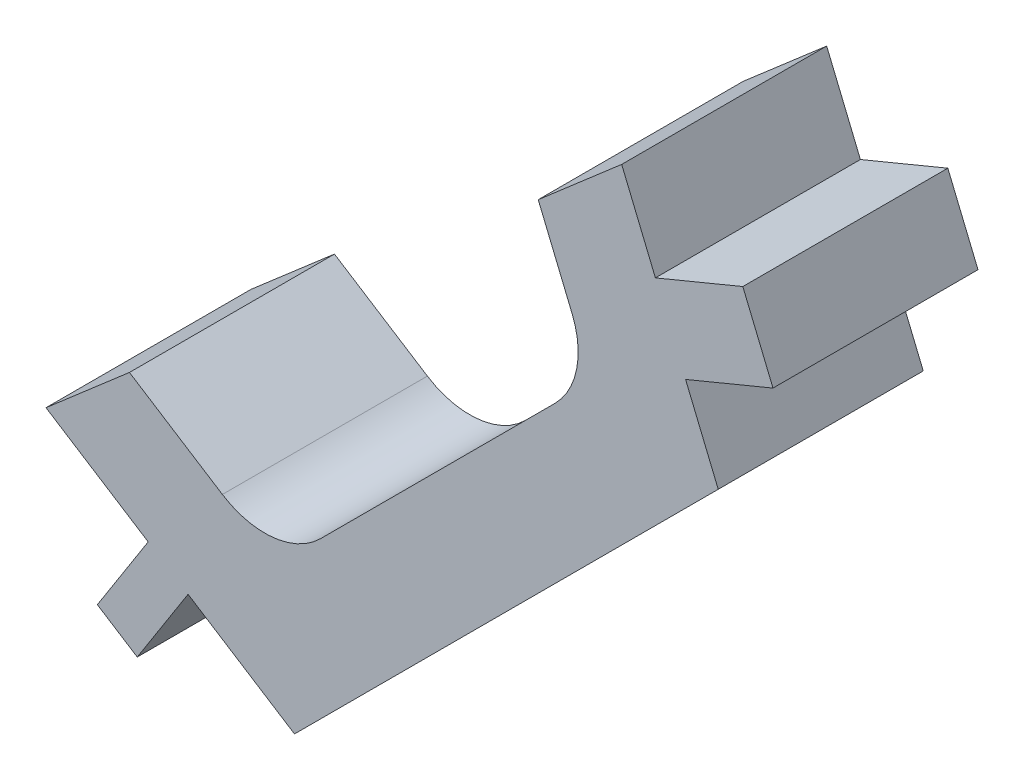
ISO-10303-21;
HEADER;
FILE_DESCRIPTION(('STEP AP214'),'2;1');
FILE_NAME('part.step','',(''),(''),'','','');
FILE_SCHEMA(('AUTOMOTIVE_DESIGN { 1 0 10303 214 1 1 1 1 }'));
ENDSEC;
DATA;
#1=APPLICATION_CONTEXT('core data for automotive mechanical design processes');
#2=APPLICATION_PROTOCOL_DEFINITION('international standard','automotive_design',2000,#1);
#3=PRODUCT_CONTEXT('',#1,'mechanical');
#4=PRODUCT('Part','Part','',(#3));
#5=PRODUCT_RELATED_PRODUCT_CATEGORY('part','',(#4));
#6=PRODUCT_DEFINITION_FORMATION('','',#4);
#7=PRODUCT_DEFINITION_CONTEXT('part definition',#1,'design');
#8=PRODUCT_DEFINITION('design','',#6,#7);
#9=PRODUCT_DEFINITION_SHAPE('','',#8);
#10=(LENGTH_UNIT() NAMED_UNIT(*) SI_UNIT(.MILLI.,.METRE.));
#11=(NAMED_UNIT(*) PLANE_ANGLE_UNIT() SI_UNIT($,.RADIAN.));
#12=(NAMED_UNIT(*) SI_UNIT($,.STERADIAN.) SOLID_ANGLE_UNIT());
#13=UNCERTAINTY_MEASURE_WITH_UNIT(LENGTH_MEASURE(1.E-05),#10,'distance_accuracy_value','');
#14=(GEOMETRIC_REPRESENTATION_CONTEXT(3) GLOBAL_UNCERTAINTY_ASSIGNED_CONTEXT((#13)) GLOBAL_UNIT_ASSIGNED_CONTEXT((#10,
#11,#12)) REPRESENTATION_CONTEXT('',''));
#15=CARTESIAN_POINT('',(0.,0.,0.));
#16=DIRECTION('',(0.,0.,1.));
#17=DIRECTION('',(1.,0.,0.));
#18=AXIS2_PLACEMENT_3D('',#15,#16,#17);
#19=CARTESIAN_POINT('',(159.283805602828,-35.5040593184353,67.31));
#20=DIRECTION('',(0.537299608346812,0.843391445812893,0.));
#21=DIRECTION('',(-0.843391445812893,0.537299608346812,0.));
#22=AXIS2_PLACEMENT_3D('',#19,#20,#21);
#23=PLANE('',#22);
#24=DIRECTION('',(0.843391445812893,-0.537299608346812,0.));
#25=VECTOR('',#24,1.);
#26=CARTESIAN_POINT('',(159.283805602828,-35.5040593184353,50.8));
#27=LINE('',#26,#25);
#28=CARTESIAN_POINT('',(23.4233337002451,51.0486069499697,50.8));
#29=VERTEX_POINT('',#28);
#30=CARTESIAN_POINT('',(31.6531404920107,45.8056417907444,50.8));
#31=VERTEX_POINT('',#30);
#32=EDGE_CURVE('E163',#29,#31,#27,.T.);
#33=ORIENTED_EDGE('',*,*,#32,.T.);
#34=DIRECTION('',(0.,0.,-1.));
#35=VECTOR('',#34,1.);
#36=CARTESIAN_POINT('',(31.6531404920107,45.8056417907444,67.31));
#37=LINE('',#36,#35);
#38=CARTESIAN_POINT('',(31.6531404920107,45.8056417907444,67.31));
#39=VERTEX_POINT('',#38);
#40=EDGE_CURVE('E11',#39,#31,#37,.T.);
#41=ORIENTED_EDGE('',*,*,#40,.F.);
#42=DIRECTION('',(0.843391445812893,-0.537299608346812,0.));
#43=VECTOR('',#42,1.);
#44=CARTESIAN_POINT('',(159.283805602828,-35.5040593184353,67.31));
#45=LINE('',#44,#43);
#46=CARTESIAN_POINT('',(23.4233337002451,51.0486069499697,67.31));
#47=VERTEX_POINT('',#46);
#48=EDGE_CURVE('E167',#47,#39,#45,.T.);
#49=ORIENTED_EDGE('',*,*,#48,.F.);
#50=DIRECTION('',(0.,0.,-1.));
#51=VECTOR('',#50,1.);
#52=CARTESIAN_POINT('',(23.4233337002451,51.0486069499697,67.31));
#53=LINE('',#52,#51);
#54=EDGE_CURVE('E179',#47,#29,#53,.T.);
#55=ORIENTED_EDGE('',*,*,#54,.T.);
#56=EDGE_LOOP('',(#33,#41,#49,#55));
#57=FACE_BOUND('',#56,.T.);
#58=ADVANCED_FACE('F37',(#57),#23,.F.);
#59=CARTESIAN_POINT('',(-26.0306651108173,-44.7397958972667,67.31));
#60=DIRECTION('',(0.843391445812893,-0.537299608346812,0.));
#61=DIRECTION('',(0.537299608346812,0.843391445812893,0.));
#62=AXIS2_PLACEMENT_3D('',#59,#60,#61);
#63=PLANE('',#62);
#64=DIRECTION('',(-0.537299608346812,-0.843391445812893,0.));
#65=VECTOR('',#64,1.);
#66=CARTESIAN_POINT('',(-26.0306651108173,-44.7397958972667,50.8));
#67=LINE('',#66,#65);
#68=CARTESIAN_POINT('',(27.558917476408,39.3789989736501,50.8));
#69=VERTEX_POINT('',#68);
#70=EDGE_CURVE('E233',#31,#69,#67,.T.);
#71=ORIENTED_EDGE('',*,*,#70,.T.);
#72=DIRECTION('',(0.,0.,-1.));
#73=VECTOR('',#72,1.);
#74=CARTESIAN_POINT('',(27.5589174764079,39.3789989736501,67.31));
#75=LINE('',#74,#73);
#76=CARTESIAN_POINT('',(27.5589174764079,39.3789989736501,67.31));
#77=VERTEX_POINT('',#76);
#78=EDGE_CURVE('E45',#77,#69,#75,.T.);
#79=ORIENTED_EDGE('',*,*,#78,.F.);
#80=DIRECTION('',(-0.537299608346812,-0.843391445812893,0.));
#81=VECTOR('',#80,1.);
#82=CARTESIAN_POINT('',(-26.0306651108173,-44.7397958972667,67.31));
#83=LINE('',#82,#81);
#84=EDGE_CURVE('E344',#39,#77,#83,.T.);
#85=ORIENTED_EDGE('',*,*,#84,.F.);
#86=ORIENTED_EDGE('',*,*,#40,.T.);
#87=EDGE_LOOP('',(#71,#79,#85,#86));
#88=FACE_BOUND('',#87,.T.);
#89=ADVANCED_FACE('F234',(#88),#63,.F.);
#90=CARTESIAN_POINT('',(155.189582587225,-41.9307021355267,67.31));
#91=DIRECTION('',(-0.537299608346799,-0.843391445812902,0.));
#92=DIRECTION('',(0.843391445812902,-0.537299608346799,0.));
#93=AXIS2_PLACEMENT_3D('',#90,#91,#92);
#94=PLANE('',#93);
#95=DIRECTION('',(-0.843391445812902,0.537299608346799,0.));
#96=VECTOR('',#95,1.);
#97=CARTESIAN_POINT('',(155.189582587225,-41.9307021355267,50.8));
#98=LINE('',#97,#96);
#99=CARTESIAN_POINT('',(30.7722388849552,37.3318874658488,50.8));
#100=VERTEX_POINT('',#99);
#101=EDGE_CURVE('E229',#100,#69,#98,.T.);
#102=ORIENTED_EDGE('',*,*,#101,.F.);
#103=DIRECTION('',(0.,0.,-1.));
#104=VECTOR('',#103,1.);
#105=CARTESIAN_POINT('',(30.7722388849551,37.3318874658488,67.31));
#106=LINE('',#105,#104);
#107=CARTESIAN_POINT('',(30.7722388849551,37.3318874658488,67.31));
#108=VERTEX_POINT('',#107);
#109=EDGE_CURVE('E220',#108,#100,#106,.T.);
#110=ORIENTED_EDGE('',*,*,#109,.F.);
#111=DIRECTION('',(-0.843391445812902,0.537299608346799,0.));
#112=VECTOR('',#111,1.);
#113=CARTESIAN_POINT('',(155.189582587225,-41.9307021355267,67.31));
#114=LINE('',#113,#112);
#115=EDGE_CURVE('E231',#108,#77,#114,.T.);
#116=ORIENTED_EDGE('',*,*,#115,.T.);
#117=ORIENTED_EDGE('',*,*,#78,.T.);
#118=EDGE_LOOP('',(#102,#110,#116,#117));
#119=FACE_BOUND('',#118,.T.);
#120=ADVANCED_FACE('F228',(#119),#94,.T.);
#121=CARTESIAN_POINT('',(-22.8173437022702,-46.786907405067,67.31));
#122=DIRECTION('',(-0.84339144581289,0.537299608346817,0.));
#123=DIRECTION('',(-0.537299608346817,-0.84339144581289,0.));
#124=AXIS2_PLACEMENT_3D('',#121,#122,#123);
#125=PLANE('',#124);
#126=DIRECTION('',(0.537299608346817,0.84339144581289,0.));
#127=VECTOR('',#126,1.);
#128=CARTESIAN_POINT('',(-22.8173437022702,-46.786907405067,50.8));
#129=LINE('',#128,#127);
#130=CARTESIAN_POINT('',(34.8664619005579,43.7585302829429,50.8));
#131=VERTEX_POINT('',#130);
#132=EDGE_CURVE('E237',#100,#131,#129,.T.);
#133=ORIENTED_EDGE('',*,*,#132,.T.);
#134=DIRECTION('',(0.,0.,-1.));
#135=VECTOR('',#134,1.);
#136=CARTESIAN_POINT('',(34.8664619005579,43.758530282943,67.31));
#137=LINE('',#136,#135);
#138=CARTESIAN_POINT('',(34.8664619005579,43.758530282943,67.31));
#139=VERTEX_POINT('',#138);
#140=EDGE_CURVE('E217',#139,#131,#137,.T.);
#141=ORIENTED_EDGE('',*,*,#140,.F.);
#142=DIRECTION('',(0.537299608346817,0.84339144581289,0.));
#143=VECTOR('',#142,1.);
#144=CARTESIAN_POINT('',(-22.8173437022702,-46.786907405067,67.31));
#145=LINE('',#144,#143);
#146=EDGE_CURVE('E341',#108,#139,#145,.T.);
#147=ORIENTED_EDGE('',*,*,#146,.F.);
#148=ORIENTED_EDGE('',*,*,#109,.T.);
#149=EDGE_LOOP('',(#133,#141,#147,#148));
#150=FACE_BOUND('',#149,.T.);
#151=ADVANCED_FACE('F340',(#150),#125,.F.);
#152=CARTESIAN_POINT('',(159.283805602828,-35.504059318435,67.31));
#153=DIRECTION('',(0.537299608346811,0.843391445812894,0.));
#154=DIRECTION('',(-0.843391445812894,0.537299608346811,0.));
#155=AXIS2_PLACEMENT_3D('',#152,#153,#154);
#156=PLANE('',#155);
#157=DIRECTION('',(0.843391445812894,-0.537299608346811,0.));
#158=VECTOR('',#157,1.);
#159=CARTESIAN_POINT('',(159.283805602828,-35.504059318435,50.8));
#160=LINE('',#159,#158);
#161=CARTESIAN_POINT('',(43.4353189900168,38.2995662621395,50.8));
#162=VERTEX_POINT('',#161);
#163=EDGE_CURVE('E244',#131,#162,#160,.T.);
#164=ORIENTED_EDGE('',*,*,#163,.T.);
#165=DIRECTION('',(0.,0.,-1.));
#166=VECTOR('',#165,1.);
#167=CARTESIAN_POINT('',(43.4353189900167,38.2995662621395,67.31));
#168=LINE('',#167,#166);
#169=CARTESIAN_POINT('',(43.4353189900167,38.2995662621395,67.31));
#170=VERTEX_POINT('',#169);
#171=EDGE_CURVE('E214',#170,#162,#168,.T.);
#172=ORIENTED_EDGE('',*,*,#171,.F.);
#173=DIRECTION('',(0.843391445812894,-0.537299608346811,0.));
#174=VECTOR('',#173,1.);
#175=CARTESIAN_POINT('',(159.283805602828,-35.504059318435,67.31));
#176=LINE('',#175,#174);
#177=EDGE_CURVE('E337',#139,#170,#176,.T.);
#178=ORIENTED_EDGE('',*,*,#177,.F.);
#179=ORIENTED_EDGE('',*,*,#140,.T.);
#180=EDGE_LOOP('',(#164,#172,#178,#179));
#181=FACE_BOUND('',#180,.T.);
#182=ADVANCED_FACE('F334',(#181),#156,.F.);
#183=CARTESIAN_POINT('',(-9.65687213928555,-14.7926248671647,67.31));
#184=DIRECTION('',(-0.70710678118656,0.707106781186535,0.));
#185=DIRECTION('',(-0.707106781186535,-0.70710678118656,0.));
#186=AXIS2_PLACEMENT_3D('',#183,#184,#185);
#187=PLANE('',#186);
#188=DIRECTION('',(0.707106781186535,0.70710678118656,0.));
#189=VECTOR('',#188,1.);
#190=CARTESIAN_POINT('',(-9.65687213928555,-14.7926248671647,50.8));
#191=LINE('',#190,#189);
#192=CARTESIAN_POINT('',(77.5602922500789,72.4245395222028,50.8));
#193=VERTEX_POINT('',#192);
#194=EDGE_CURVE('E247',#162,#193,#191,.T.);
#195=ORIENTED_EDGE('',*,*,#194,.T.);
#196=DIRECTION('',(0.,0.,-1.));
#197=VECTOR('',#196,1.);
#198=CARTESIAN_POINT('',(77.5602922500789,72.4245395222028,67.31));
#199=LINE('',#198,#197);
#200=CARTESIAN_POINT('',(77.5602922500789,72.4245395222028,67.31));
#201=VERTEX_POINT('',#200);
#202=EDGE_CURVE('E211',#201,#193,#199,.T.);
#203=ORIENTED_EDGE('',*,*,#202,.F.);
#204=DIRECTION('',(0.707106781186535,0.70710678118656,0.));
#205=VECTOR('',#204,1.);
#206=CARTESIAN_POINT('',(-9.65687213928555,-14.7926248671647,67.31));
#207=LINE('',#206,#205);
#208=EDGE_CURVE('E331',#170,#201,#207,.T.);
#209=ORIENTED_EDGE('',*,*,#208,.F.);
#210=ORIENTED_EDGE('',*,*,#171,.T.);
#211=EDGE_LOOP('',(#195,#203,#209,#210));
#212=FACE_BOUND('',#211,.T.);
#213=ADVANCED_FACE('F330',(#212),#187,.F.);
#214=CARTESIAN_POINT('',(151.251994500624,-105.482967485413,67.31));
#215=DIRECTION('',(-0.92387953251128,-0.382683432365107,0.));
#216=DIRECTION('',(0.382683432365107,-0.92387953251128,0.));
#217=AXIS2_PLACEMENT_3D('',#214,#215,#216);
#218=PLANE('',#217);
#219=DIRECTION('',(-0.382683432365107,0.92387953251128,0.));
#220=VECTOR('',#219,1.);
#221=CARTESIAN_POINT('',(151.251994500624,-105.482967485413,50.8));
#222=LINE('',#221,#220);
#223=CARTESIAN_POINT('',(74.9300361290097,78.7745395222027,50.8));
#224=VERTEX_POINT('',#223);
#225=EDGE_CURVE('E250',#193,#224,#222,.T.);
#226=ORIENTED_EDGE('',*,*,#225,.T.);
#227=DIRECTION('',(0.,0.,-1.));
#228=VECTOR('',#227,1.);
#229=CARTESIAN_POINT('',(74.9300361290097,78.7745395222028,67.31));
#230=LINE('',#229,#228);
#231=CARTESIAN_POINT('',(74.9300361290097,78.7745395222028,67.31));
#232=VERTEX_POINT('',#231);
#233=EDGE_CURVE('E208',#232,#224,#230,.T.);
#234=ORIENTED_EDGE('',*,*,#233,.F.);
#235=DIRECTION('',(-0.382683432365107,0.92387953251128,0.));
#236=VECTOR('',#235,1.);
#237=CARTESIAN_POINT('',(151.251994500624,-105.482967485413,67.31));
#238=LINE('',#237,#236);
#239=EDGE_CURVE('E327',#201,#232,#238,.T.);
#240=ORIENTED_EDGE('',*,*,#239,.F.);
#241=ORIENTED_EDGE('',*,*,#202,.T.);
#242=EDGE_LOOP('',(#226,#234,#240,#241));
#243=FACE_BOUND('',#242,.T.);
#244=ADVANCED_FACE('F324',(#243),#218,.F.);
#245=CARTESIAN_POINT('',(25.2780416283897,58.2080100011718,67.31));
#246=DIRECTION('',(-0.382683432365087,0.923879532511288,0.));
#247=DIRECTION('',(-0.923879532511288,-0.382683432365087,0.));
#248=AXIS2_PLACEMENT_3D('',#245,#246,#247);
#249=PLANE('',#248);
#250=DIRECTION('',(0.923879532511288,0.382683432365087,0.));
#251=VECTOR('',#250,1.);
#252=CARTESIAN_POINT('',(25.2780416283897,58.2080100011718,50.8));
#253=LINE('',#252,#251);
#254=CARTESIAN_POINT('',(81.9699981667456,81.6905872768247,50.8));
#255=VERTEX_POINT('',#254);
#256=EDGE_CURVE('E253',#224,#255,#253,.T.);
#257=ORIENTED_EDGE('',*,*,#256,.T.);
#258=DIRECTION('',(0.,0.,-1.));
#259=VECTOR('',#258,1.);
#260=CARTESIAN_POINT('',(81.9699981667456,81.6905872768247,67.31));
#261=LINE('',#260,#259);
#262=CARTESIAN_POINT('',(81.9699981667456,81.6905872768247,67.31));
#263=VERTEX_POINT('',#262);
#264=EDGE_CURVE('E205',#263,#255,#261,.T.);
#265=ORIENTED_EDGE('',*,*,#264,.F.);
#266=DIRECTION('',(0.923879532511288,0.382683432365087,0.));
#267=VECTOR('',#266,1.);
#268=CARTESIAN_POINT('',(25.2780416283897,58.2080100011718,67.31));
#269=LINE('',#268,#267);
#270=EDGE_CURVE('E321',#232,#263,#269,.T.);
#271=ORIENTED_EDGE('',*,*,#270,.F.);
#272=ORIENTED_EDGE('',*,*,#233,.T.);
#273=EDGE_LOOP('',(#257,#265,#271,#272));
#274=FACE_BOUND('',#273,.T.);
#275=ADVANCED_FACE('F320',(#274),#249,.F.);
#276=CARTESIAN_POINT('',(158.291956538356,-102.566919730793,67.31));
#277=DIRECTION('',(-0.923879532511287,-0.382683432365089,0.));
#278=DIRECTION('',(0.382683432365089,-0.923879532511287,0.));
#279=AXIS2_PLACEMENT_3D('',#276,#277,#278);
#280=PLANE('',#279);
#281=DIRECTION('',(-0.382683432365089,0.923879532511287,0.));
#282=VECTOR('',#281,1.);
#283=CARTESIAN_POINT('',(158.291956538356,-102.566919730793,50.8));
#284=LINE('',#283,#282);
#285=CARTESIAN_POINT('',(79.5399583712273,87.5572223082712,50.8));
#286=VERTEX_POINT('',#285);
#287=EDGE_CURVE('E256',#255,#286,#284,.T.);
#288=ORIENTED_EDGE('',*,*,#287,.T.);
#289=DIRECTION('',(0.,0.,-1.));
#290=VECTOR('',#289,1.);
#291=CARTESIAN_POINT('',(79.5399583712273,87.5572223082712,67.31));
#292=LINE('',#291,#290);
#293=CARTESIAN_POINT('',(79.5399583712273,87.5572223082712,67.31));
#294=VERTEX_POINT('',#293);
#295=EDGE_CURVE('E202',#294,#286,#292,.T.);
#296=ORIENTED_EDGE('',*,*,#295,.F.);
#297=DIRECTION('',(-0.382683432365089,0.923879532511287,0.));
#298=VECTOR('',#297,1.);
#299=CARTESIAN_POINT('',(158.291956538356,-102.566919730793,67.31));
#300=LINE('',#299,#298);
#301=EDGE_CURVE('E317',#263,#294,#300,.T.);
#302=ORIENTED_EDGE('',*,*,#301,.F.);
#303=ORIENTED_EDGE('',*,*,#264,.T.);
#304=EDGE_LOOP('',(#288,#296,#302,#303));
#305=FACE_BOUND('',#304,.T.);
#306=ADVANCED_FACE('F314',(#305),#280,.F.);
#307=CARTESIAN_POINT('',(22.8480018328715,64.0746450326184,67.31));
#308=DIRECTION('',(0.382683432365086,-0.923879532511288,0.));
#309=DIRECTION('',(0.923879532511288,0.382683432365086,0.));
#310=AXIS2_PLACEMENT_3D('',#307,#308,#309);
#311=PLANE('',#310);
#312=DIRECTION('',(-0.923879532511288,-0.382683432365086,0.));
#313=VECTOR('',#312,1.);
#314=CARTESIAN_POINT('',(22.8480018328715,64.0746450326184,50.8));
#315=LINE('',#314,#313);
#316=CARTESIAN_POINT('',(72.4999963334913,84.6411745536492,50.8));
#317=VERTEX_POINT('',#316);
#318=EDGE_CURVE('E259',#286,#317,#315,.T.);
#319=ORIENTED_EDGE('',*,*,#318,.T.);
#320=DIRECTION('',(0.,0.,-1.));
#321=VECTOR('',#320,1.);
#322=CARTESIAN_POINT('',(72.4999963334913,84.6411745536492,67.31));
#323=LINE('',#322,#321);
#324=CARTESIAN_POINT('',(72.4999963334913,84.6411745536492,67.31));
#325=VERTEX_POINT('',#324);
#326=EDGE_CURVE('E199',#325,#317,#323,.T.);
#327=ORIENTED_EDGE('',*,*,#326,.F.);
#328=DIRECTION('',(-0.923879532511288,-0.382683432365086,0.));
#329=VECTOR('',#328,1.);
#330=CARTESIAN_POINT('',(22.8480018328715,64.0746450326184,67.31));
#331=LINE('',#330,#329);
#332=EDGE_CURVE('E311',#294,#325,#331,.T.);
#333=ORIENTED_EDGE('',*,*,#332,.F.);
#334=ORIENTED_EDGE('',*,*,#295,.T.);
#335=EDGE_LOOP('',(#319,#327,#333,#334));
#336=FACE_BOUND('',#335,.T.);
#337=ADVANCED_FACE('F310',(#336),#311,.F.);
#338=CARTESIAN_POINT('',(151.251994500623,-105.482967485413,67.31));
#339=DIRECTION('',(-0.92387953251128,-0.382683432365105,0.));
#340=DIRECTION('',(0.382683432365105,-0.923879532511281,0.));
#341=AXIS2_PLACEMENT_3D('',#338,#339,#340);
#342=PLANE('',#341);
#343=DIRECTION('',(-0.382683432365105,0.923879532511281,0.));
#344=VECTOR('',#343,1.);
#345=CARTESIAN_POINT('',(151.251994500623,-105.482967485413,50.8));
#346=LINE('',#345,#344);
#347=CARTESIAN_POINT('',(69.7841649044199,91.1977716228321,50.8));
#348=VERTEX_POINT('',#347);
#349=EDGE_CURVE('E262',#317,#348,#346,.T.);
#350=ORIENTED_EDGE('',*,*,#349,.T.);
#351=DIRECTION('',(0.,0.,-1.));
#352=VECTOR('',#351,1.);
#353=CARTESIAN_POINT('',(69.7841649044199,91.1977716228321,67.31));
#354=LINE('',#353,#352);
#355=CARTESIAN_POINT('',(69.7841649044199,91.1977716228321,67.31));
#356=VERTEX_POINT('',#355);
#357=EDGE_CURVE('E196',#356,#348,#354,.T.);
#358=ORIENTED_EDGE('',*,*,#357,.F.);
#359=DIRECTION('',(-0.382683432365105,0.923879532511281,0.));
#360=VECTOR('',#359,1.);
#361=CARTESIAN_POINT('',(151.251994500623,-105.482967485413,67.31));
#362=LINE('',#361,#360);
#363=EDGE_CURVE('E307',#325,#356,#362,.T.);
#364=ORIENTED_EDGE('',*,*,#363,.F.);
#365=ORIENTED_EDGE('',*,*,#326,.T.);
#366=EDGE_LOOP('',(#350,#358,#364,#365));
#367=FACE_BOUND('',#366,.T.);
#368=ADVANCED_FACE('F304',(#367),#342,.F.);
#369=CARTESIAN_POINT('',(-19.5444943430601,13.837833136437,67.31));
#370=DIRECTION('',(0.65464907824566,-0.755932923183075,0.));
#371=DIRECTION('',(0.755932923183075,0.65464907824566,0.));
#372=AXIS2_PLACEMENT_3D('',#369,#370,#371);
#373=PLANE('',#372);
#374=DIRECTION('',(-0.755932923183075,-0.65464907824566,0.));
#375=VECTOR('',#374,1.);
#376=CARTESIAN_POINT('',(-19.5444943430601,13.837833136437,50.8));
#377=LINE('',#376,#375);
#378=CARTESIAN_POINT('',(63.0639212173224,85.3779413172282,50.8));
#379=VERTEX_POINT('',#378);
#380=EDGE_CURVE('E265',#348,#379,#377,.T.);
#381=ORIENTED_EDGE('',*,*,#380,.T.);
#382=DIRECTION('',(0.,0.,-1.));
#383=VECTOR('',#382,1.);
#384=CARTESIAN_POINT('',(63.0639212173224,85.3779413172282,67.31));
#385=LINE('',#384,#383);
#386=CARTESIAN_POINT('',(63.0639212173224,85.3779413172282,67.31));
#387=VERTEX_POINT('',#386);
#388=EDGE_CURVE('E193',#387,#379,#385,.T.);
#389=ORIENTED_EDGE('',*,*,#388,.F.);
#390=DIRECTION('',(-0.755932923183075,-0.65464907824566,0.));
#391=VECTOR('',#390,1.);
#392=CARTESIAN_POINT('',(-19.5444943430601,13.837833136437,67.31));
#393=LINE('',#392,#391);
#394=EDGE_CURVE('E301',#356,#387,#393,.T.);
#395=ORIENTED_EDGE('',*,*,#394,.F.);
#396=ORIENTED_EDGE('',*,*,#357,.T.);
#397=EDGE_LOOP('',(#381,#389,#395,#396));
#398=FACE_BOUND('',#397,.T.);
#399=ADVANCED_FACE('F300',(#398),#373,.F.);
#400=CARTESIAN_POINT('',(143.458286978664,-108.711226842178,67.31));
#401=DIRECTION('',(0.92387953251128,0.382683432365106,0.));
#402=DIRECTION('',(-0.382683432365106,0.92387953251128,0.));
#403=AXIS2_PLACEMENT_3D('',#400,#401,#402);
#404=PLANE('',#403);
#405=DIRECTION('',(0.382683432365105,-0.92387953251128,0.));
#406=VECTOR('',#405,1.);
#407=CARTESIAN_POINT('',(143.458286978664,-108.711226842178,50.8));
#408=LINE('',#407,#406);
#409=CARTESIAN_POINT('',(65.7977142863939,78.7779810131553,50.8));
#410=VERTEX_POINT('',#409);
#411=EDGE_CURVE('E268',#379,#410,#408,.T.);
#412=ORIENTED_EDGE('',*,*,#411,.T.);
#413=DIRECTION('',(0.,0.,-1.));
#414=VECTOR('',#413,1.);
#415=CARTESIAN_POINT('',(65.7977142863937,78.7779810131552,67.31));
#416=LINE('',#415,#414);
#417=CARTESIAN_POINT('',(65.7977142863937,78.7779810131552,67.31));
#418=VERTEX_POINT('',#417);
#419=EDGE_CURVE('E190',#418,#410,#416,.T.);
#420=ORIENTED_EDGE('',*,*,#419,.F.);
#421=DIRECTION('',(0.382683432365105,-0.92387953251128,0.));
#422=VECTOR('',#421,1.);
#423=CARTESIAN_POINT('',(143.458286978664,-108.711226842178,67.31));
#424=LINE('',#423,#422);
#425=EDGE_CURVE('E297',#387,#418,#424,.T.);
#426=ORIENTED_EDGE('',*,*,#425,.F.);
#427=ORIENTED_EDGE('',*,*,#388,.T.);
#428=EDGE_LOOP('',(#412,#420,#426,#427));
#429=FACE_BOUND('',#428,.T.);
#430=ADVANCED_FACE('F294',(#429),#404,.F.);
#431=CARTESIAN_POINT('',(59.931079254947,76.3479412176369,67.31));
#432=DIRECTION('',(0.,0.,-1.));
#433=DIRECTION('',(-1.,0.,0.));
#434=AXIS2_PLACEMENT_3D('',#431,#432,#433);
#435=CYLINDRICAL_SURFACE('',#434,6.35000000000026);
#436=CARTESIAN_POINT('',(59.931079254947,76.3479412176369,50.8));
#437=DIRECTION('',(0.,0.,1.));
#438=DIRECTION('',(1.,0.,0.));
#439=AXIS2_PLACEMENT_3D('',#436,#437,#438);
#440=CIRCLE('',#439,6.35000000000026);
#441=CARTESIAN_POINT('',(64.421207315482,71.8578131571019,50.8));
#442=VERTEX_POINT('',#441);
#443=EDGE_CURVE('E271',#410,#442,#440,.F.);
#444=ORIENTED_EDGE('',*,*,#443,.T.);
#445=DIRECTION('',(0.,0.,-1.));
#446=VECTOR('',#445,1.);
#447=CARTESIAN_POINT('',(64.421207315482,71.8578131571019,67.31));
#448=LINE('',#447,#446);
#449=CARTESIAN_POINT('',(64.421207315482,71.8578131571019,67.31));
#450=VERTEX_POINT('',#449);
#451=EDGE_CURVE('E187',#450,#442,#448,.T.);
#452=ORIENTED_EDGE('',*,*,#451,.F.);
#453=CARTESIAN_POINT('',(59.931079254947,76.3479412176369,67.31));
#454=DIRECTION('',(0.,0.,1.));
#455=DIRECTION('',(1.,0.,0.));
#456=AXIS2_PLACEMENT_3D('',#453,#454,#455);
#457=CIRCLE('',#456,6.35000000000026);
#458=EDGE_CURVE('E291',#418,#450,#457,.F.);
#459=ORIENTED_EDGE('',*,*,#458,.F.);
#460=ORIENTED_EDGE('',*,*,#419,.T.);
#461=EDGE_LOOP('',(#444,#452,#459,#460));
#462=FACE_BOUND('',#461,.T.);
#463=ADVANCED_FACE('F290',(#462),#435,.F.);
#464=CARTESIAN_POINT('',(-15.9430514240331,-8.50644558241324,67.31));
#465=DIRECTION('',(0.707106781186548,-0.707106781186547,0.));
#466=DIRECTION('',(0.707106781186547,0.707106781186548,0.));
#467=AXIS2_PLACEMENT_3D('',#464,#465,#466);
#468=PLANE('',#467);
#469=DIRECTION('',(-0.707106781186547,-0.707106781186548,0.));
#470=VECTOR('',#469,1.);
#471=CARTESIAN_POINT('',(-15.9430514240331,-8.50644558241324,50.8));
#472=LINE('',#471,#470);
#473=CARTESIAN_POINT('',(45.5294646487991,52.9660704904193,50.8));
#474=VERTEX_POINT('',#473);
#475=EDGE_CURVE('E274',#442,#474,#472,.T.);
#476=ORIENTED_EDGE('',*,*,#475,.T.);
#477=DIRECTION('',(0.,0.,-1.));
#478=VECTOR('',#477,1.);
#479=CARTESIAN_POINT('',(45.5294646487992,52.9660704904191,67.31));
#480=LINE('',#479,#478);
#481=CARTESIAN_POINT('',(45.5294646487992,52.9660704904191,67.31));
#482=VERTEX_POINT('',#481);
#483=EDGE_CURVE('E181',#482,#474,#480,.T.);
#484=ORIENTED_EDGE('',*,*,#483,.F.);
#485=DIRECTION('',(-0.707106781186547,-0.707106781186548,0.));
#486=VECTOR('',#485,1.);
#487=CARTESIAN_POINT('',(-15.9430514240331,-8.50644558241324,67.31));
#488=LINE('',#487,#486);
#489=EDGE_CURVE('E287',#450,#482,#488,.T.);
#490=ORIENTED_EDGE('',*,*,#489,.F.);
#491=ORIENTED_EDGE('',*,*,#451,.T.);
#492=EDGE_LOOP('',(#476,#484,#490,#491));
#493=FACE_BOUND('',#492,.T.);
#494=ADVANCED_FACE('F285',(#493),#468,.F.);
#495=CARTESIAN_POINT('',(41.0393365882642,57.4561985509541,67.31));
#496=DIRECTION('',(0.,0.,-1.));
#497=DIRECTION('',(-1.,0.,0.));
#498=AXIS2_PLACEMENT_3D('',#495,#496,#497);
#499=CYLINDRICAL_SURFACE('',#498,6.3500000000004);
#500=CARTESIAN_POINT('',(41.0393365882642,57.4561985509541,50.8));
#501=DIRECTION('',(0.,0.,1.));
#502=DIRECTION('',(1.,0.,0.));
#503=AXIS2_PLACEMENT_3D('',#500,#501,#502);
#504=CIRCLE('',#503,6.3500000000004);
#505=CARTESIAN_POINT('',(37.6274840752623,52.1006628700418,50.8));
#506=VERTEX_POINT('',#505);
#507=EDGE_CURVE('E176',#506,#474,#504,.T.);
#508=ORIENTED_EDGE('',*,*,#507,.F.);
#509=DIRECTION('',(0.,0.,-1.));
#510=VECTOR('',#509,1.);
#511=CARTESIAN_POINT('',(37.6274840752623,52.1006628700418,67.31));
#512=LINE('',#511,#510);
#513=CARTESIAN_POINT('',(37.6274840752623,52.1006628700418,67.31));
#514=VERTEX_POINT('',#513);
#515=EDGE_CURVE('E174',#514,#506,#512,.T.);
#516=ORIENTED_EDGE('',*,*,#515,.F.);
#517=CARTESIAN_POINT('',(41.0393365882642,57.4561985509541,67.31));
#518=DIRECTION('',(0.,0.,1.));
#519=DIRECTION('',(1.,0.,0.));
#520=AXIS2_PLACEMENT_3D('',#517,#518,#519);
#521=CIRCLE('',#520,6.3500000000004);
#522=EDGE_CURVE('E282',#514,#482,#521,.T.);
#523=ORIENTED_EDGE('',*,*,#522,.T.);
#524=ORIENTED_EDGE('',*,*,#483,.T.);
#525=EDGE_LOOP('',(#508,#516,#523,#524));
#526=FACE_BOUND('',#525,.T.);
#527=ADVANCED_FACE('F280',(#526),#499,.F.);
#528=CARTESIAN_POINT('',(163.861157356219,-28.3190562897426,67.31));
#529=DIRECTION('',(-0.53729960834681,-0.843391445812895,0.));
#530=DIRECTION('',(0.843391445812895,-0.53729960834681,0.));
#531=AXIS2_PLACEMENT_3D('',#528,#529,#530);
#532=PLANE('',#531);
#533=DIRECTION('',(-0.843391445812894,0.53729960834681,0.));
#534=VECTOR('',#533,1.);
#535=CARTESIAN_POINT('',(163.861157356219,-28.3190562897426,50.8));
#536=LINE('',#535,#534);
#537=CARTESIAN_POINT('',(30.1435773873427,56.8684372555736,50.8));
#538=VERTEX_POINT('',#537);
#539=EDGE_CURVE('E160',#506,#538,#536,.T.);
#540=ORIENTED_EDGE('',*,*,#539,.T.);
#541=DIRECTION('',(0.,0.,-1.));
#542=VECTOR('',#541,1.);
#543=CARTESIAN_POINT('',(30.1435773873427,56.8684372555735,67.31));
#544=LINE('',#543,#542);
#545=CARTESIAN_POINT('',(30.1435773873427,56.8684372555735,67.31));
#546=VERTEX_POINT('',#545);
#547=EDGE_CURVE('E173',#546,#538,#544,.T.);
#548=ORIENTED_EDGE('',*,*,#547,.F.);
#549=DIRECTION('',(-0.843391445812894,0.53729960834681,0.));
#550=VECTOR('',#549,1.);
#551=CARTESIAN_POINT('',(163.861157356219,-28.3190562897426,67.31));
#552=LINE('',#551,#550);
#553=EDGE_CURVE('E361',#514,#546,#552,.T.);
#554=ORIENTED_EDGE('',*,*,#553,.F.);
#555=ORIENTED_EDGE('',*,*,#515,.T.);
#556=EDGE_LOOP('',(#540,#548,#554,#555));
#557=FACE_BOUND('',#556,.T.);
#558=ADVANCED_FACE('F171',(#557),#532,.F.);
#559=CARTESIAN_POINT('',(-19.54449434306,13.8378331364374,67.31));
#560=DIRECTION('',(0.654649078245658,-0.755932923183076,0.));
#561=DIRECTION('',(0.755932923183076,0.654649078245658,0.));
#562=AXIS2_PLACEMENT_3D('',#559,#560,#561);
#563=PLANE('',#562);
#564=DIRECTION('',(-0.755932923183076,-0.654649078245658,0.));
#565=VECTOR('',#564,1.);
#566=CARTESIAN_POINT('',(-19.54449434306,13.8378331364374,50.8));
#567=LINE('',#566,#565);
#568=EDGE_CURVE('E157',#538,#29,#567,.T.);
#569=ORIENTED_EDGE('',*,*,#568,.T.);
#570=ORIENTED_EDGE('',*,*,#54,.F.);
#571=DIRECTION('',(-0.755932923183076,-0.654649078245658,0.));
#572=VECTOR('',#571,1.);
#573=CARTESIAN_POINT('',(-19.54449434306,13.8378331364374,67.31));
#574=LINE('',#573,#572);
#575=EDGE_CURVE('E52',#546,#47,#574,.T.);
#576=ORIENTED_EDGE('',*,*,#575,.F.);
#577=ORIENTED_EDGE('',*,*,#547,.T.);
#578=EDGE_LOOP('',(#569,#570,#576,#577));
#579=FACE_BOUND('',#578,.T.);
#580=ADVANCED_FACE('F178',(#579),#563,.F.);
#581=CARTESIAN_POINT('',(101.6,-126.049497006446,67.31));
#582=DIRECTION('',(0.,0.,1.));
#583=DIRECTION('',(1.,0.,0.));
#584=AXIS2_PLACEMENT_3D('',#581,#582,#583);
#585=PLANE('',#584);
#586=ORIENTED_EDGE('',*,*,#48,.T.);
#587=ORIENTED_EDGE('',*,*,#84,.T.);
#588=ORIENTED_EDGE('',*,*,#115,.F.);
#589=ORIENTED_EDGE('',*,*,#146,.T.);
#590=ORIENTED_EDGE('',*,*,#177,.T.);
#591=ORIENTED_EDGE('',*,*,#208,.T.);
#592=ORIENTED_EDGE('',*,*,#239,.T.);
#593=ORIENTED_EDGE('',*,*,#270,.T.);
#594=ORIENTED_EDGE('',*,*,#301,.T.);
#595=ORIENTED_EDGE('',*,*,#332,.T.);
#596=ORIENTED_EDGE('',*,*,#363,.T.);
#597=ORIENTED_EDGE('',*,*,#394,.T.);
#598=ORIENTED_EDGE('',*,*,#425,.T.);
#599=ORIENTED_EDGE('',*,*,#458,.T.);
#600=ORIENTED_EDGE('',*,*,#489,.T.);
#601=ORIENTED_EDGE('',*,*,#522,.F.);
#602=ORIENTED_EDGE('',*,*,#553,.T.);
#603=ORIENTED_EDGE('',*,*,#575,.T.);
#604=EDGE_LOOP('',(#586,#587,#588,#589,#590,#591,#592,#593,#594,#595,#596,#597,#598,#599,#600,
#601,#602,#603));
#605=FACE_BOUND('',#604,.T.);
#606=ADVANCED_FACE('F343',(#605),#585,.T.);
#607=CARTESIAN_POINT('',(101.6,1270.,50.8));
#608=DIRECTION('',(0.,0.,-1.));
#609=DIRECTION('',(-1.,0.,0.));
#610=AXIS2_PLACEMENT_3D('',#607,#608,#609);
#611=PLANE('',#610);
#612=ORIENTED_EDGE('',*,*,#32,.F.);
#613=ORIENTED_EDGE('',*,*,#568,.F.);
#614=ORIENTED_EDGE('',*,*,#539,.F.);
#615=ORIENTED_EDGE('',*,*,#507,.T.);
#616=ORIENTED_EDGE('',*,*,#475,.F.);
#617=ORIENTED_EDGE('',*,*,#443,.F.);
#618=ORIENTED_EDGE('',*,*,#411,.F.);
#619=ORIENTED_EDGE('',*,*,#380,.F.);
#620=ORIENTED_EDGE('',*,*,#349,.F.);
#621=ORIENTED_EDGE('',*,*,#318,.F.);
#622=ORIENTED_EDGE('',*,*,#287,.F.);
#623=ORIENTED_EDGE('',*,*,#256,.F.);
#624=ORIENTED_EDGE('',*,*,#225,.F.);
#625=ORIENTED_EDGE('',*,*,#194,.F.);
#626=ORIENTED_EDGE('',*,*,#163,.F.);
#627=ORIENTED_EDGE('',*,*,#132,.F.);
#628=ORIENTED_EDGE('',*,*,#101,.T.);
#629=ORIENTED_EDGE('',*,*,#70,.F.);
#630=EDGE_LOOP('',(#612,#613,#614,#615,#616,#617,#618,#619,#620,#621,#622,#623,#624,#625,#626,
#627,#628,#629));
#631=FACE_BOUND('',#630,.T.);
#632=ADVANCED_FACE('F159',(#631),#611,.T.);
#633=CLOSED_SHELL('',(#58,#89,#120,#151,#182,#213,#244,#275,#306,#337,#368,#399,#430,#463,#494,
#527,#558,#580,#606,#632));
#634=MANIFOLD_SOLID_BREP('B2',#633);
#635=ADVANCED_BREP_SHAPE_REPRESENTATION('',(#18,#634),#14);
#636=SHAPE_DEFINITION_REPRESENTATION(#9,#635);
ENDSEC;
END-ISO-10303-21;
